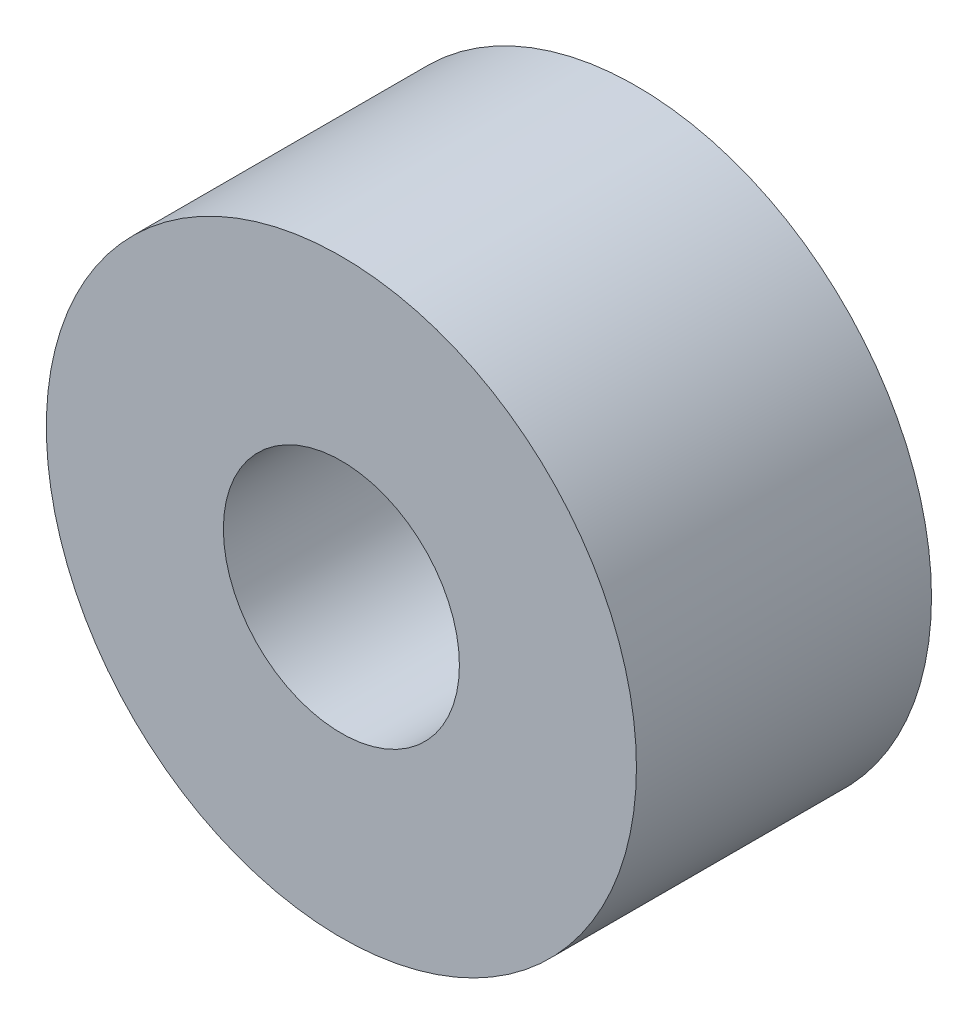
ISO-10303-21;
HEADER;
FILE_DESCRIPTION(('STEP AP214'),'2;1');
FILE_NAME('part.step','',(''),(''),'','','');
FILE_SCHEMA(('AUTOMOTIVE_DESIGN { 1 0 10303 214 1 1 1 1 }'));
ENDSEC;
DATA;
#1=APPLICATION_CONTEXT('core data for automotive mechanical design processes');
#2=APPLICATION_PROTOCOL_DEFINITION('international standard','automotive_design',2000,#1);
#3=PRODUCT_CONTEXT('',#1,'mechanical');
#4=PRODUCT('Part','Part','',(#3));
#5=PRODUCT_RELATED_PRODUCT_CATEGORY('part','',(#4));
#6=PRODUCT_DEFINITION_FORMATION('','',#4);
#7=PRODUCT_DEFINITION_CONTEXT('part definition',#1,'design');
#8=PRODUCT_DEFINITION('design','',#6,#7);
#9=PRODUCT_DEFINITION_SHAPE('','',#8);
#10=(LENGTH_UNIT() NAMED_UNIT(*) SI_UNIT(.MILLI.,.METRE.));
#11=(NAMED_UNIT(*) PLANE_ANGLE_UNIT() SI_UNIT($,.RADIAN.));
#12=(NAMED_UNIT(*) SI_UNIT($,.STERADIAN.) SOLID_ANGLE_UNIT());
#13=UNCERTAINTY_MEASURE_WITH_UNIT(LENGTH_MEASURE(1.E-05),#10,'distance_accuracy_value','');
#14=(GEOMETRIC_REPRESENTATION_CONTEXT(3) GLOBAL_UNCERTAINTY_ASSIGNED_CONTEXT((#13)) GLOBAL_UNIT_ASSIGNED_CONTEXT((#10,
#11,#12)) REPRESENTATION_CONTEXT('',''));
#15=CARTESIAN_POINT('',(0.,0.,0.));
#16=DIRECTION('',(0.,0.,1.));
#17=DIRECTION('',(1.,0.,0.));
#18=AXIS2_PLACEMENT_3D('',#15,#16,#17);
#19=CARTESIAN_POINT('',(0.,0.,1.25));
#20=DIRECTION('',(0.,0.,1.));
#21=DIRECTION('',(1.,0.,0.));
#22=AXIS2_PLACEMENT_3D('',#19,#20,#21);
#23=PLANE('',#22);
#24=CARTESIAN_POINT('',(0.,0.,1.25));
#25=DIRECTION('',(0.,0.,1.));
#26=DIRECTION('',(1.,0.,0.));
#27=AXIS2_PLACEMENT_3D('',#24,#25,#26);
#28=CIRCLE('',#27,2.5);
#29=CARTESIAN_POINT('',(2.5,0.,1.25));
#30=VERTEX_POINT('',#29);
#31=EDGE_CURVE('E10',#30,#30,#28,.T.);
#32=ORIENTED_EDGE('',*,*,#31,.T.);
#33=EDGE_LOOP('',(#32));
#34=FACE_BOUND('',#33,.T.);
#35=CARTESIAN_POINT('',(0.,0.,1.25));
#36=DIRECTION('',(0.,0.,1.));
#37=DIRECTION('',(1.,0.,0.));
#38=AXIS2_PLACEMENT_3D('',#35,#36,#37);
#39=CIRCLE('',#38,1.);
#40=CARTESIAN_POINT('',(1.,0.,1.25));
#41=VERTEX_POINT('',#40);
#42=EDGE_CURVE('E42',#41,#41,#39,.T.);
#43=ORIENTED_EDGE('',*,*,#42,.F.);
#44=EDGE_LOOP('',(#43));
#45=FACE_BOUND('',#44,.T.);
#46=ADVANCED_FACE('F31',(#34,#45),#23,.T.);
#47=CARTESIAN_POINT('',(0.,0.,-1.25));
#48=DIRECTION('',(0.,0.,1.));
#49=DIRECTION('',(1.,0.,0.));
#50=AXIS2_PLACEMENT_3D('',#47,#48,#49);
#51=PLANE('',#50);
#52=CARTESIAN_POINT('',(0.,0.,-1.25));
#53=DIRECTION('',(0.,0.,1.));
#54=DIRECTION('',(1.,0.,0.));
#55=AXIS2_PLACEMENT_3D('',#52,#53,#54);
#56=CIRCLE('',#55,2.5);
#57=CARTESIAN_POINT('',(2.5,0.,-1.25));
#58=VERTEX_POINT('',#57);
#59=EDGE_CURVE('E35',#58,#58,#56,.T.);
#60=ORIENTED_EDGE('',*,*,#59,.F.);
#61=EDGE_LOOP('',(#60));
#62=FACE_BOUND('',#61,.T.);
#63=CARTESIAN_POINT('',(0.,0.,-1.25));
#64=DIRECTION('',(0.,0.,1.));
#65=DIRECTION('',(1.,0.,0.));
#66=AXIS2_PLACEMENT_3D('',#63,#64,#65);
#67=CIRCLE('',#66,1.);
#68=CARTESIAN_POINT('',(1.,0.,-1.25));
#69=VERTEX_POINT('',#68);
#70=EDGE_CURVE('E44',#69,#69,#67,.T.);
#71=ORIENTED_EDGE('',*,*,#70,.T.);
#72=EDGE_LOOP('',(#71));
#73=FACE_BOUND('',#72,.T.);
#74=ADVANCED_FACE('F54',(#62,#73),#51,.F.);
#75=CARTESIAN_POINT('',(0.,0.,1.25));
#76=DIRECTION('',(0.,0.,-1.));
#77=DIRECTION('',(-1.,0.,0.));
#78=AXIS2_PLACEMENT_3D('',#75,#76,#77);
#79=CYLINDRICAL_SURFACE('',#78,2.5);
#80=ORIENTED_EDGE('',*,*,#31,.F.);
#81=EDGE_LOOP('',(#80));
#82=FACE_BOUND('',#81,.T.);
#83=ORIENTED_EDGE('',*,*,#59,.T.);
#84=EDGE_LOOP('',(#83));
#85=FACE_BOUND('',#84,.T.);
#86=ADVANCED_FACE('F33',(#82,#85),#79,.T.);
#87=CARTESIAN_POINT('',(0.,0.,1.25));
#88=DIRECTION('',(0.,0.,-1.));
#89=DIRECTION('',(-1.,0.,0.));
#90=AXIS2_PLACEMENT_3D('',#87,#88,#89);
#91=CYLINDRICAL_SURFACE('',#90,1.);
#92=ORIENTED_EDGE('',*,*,#42,.T.);
#93=EDGE_LOOP('',(#92));
#94=FACE_BOUND('',#93,.T.);
#95=ORIENTED_EDGE('',*,*,#70,.F.);
#96=EDGE_LOOP('',(#95));
#97=FACE_BOUND('',#96,.T.);
#98=ADVANCED_FACE('F50',(#94,#97),#91,.F.);
#99=CLOSED_SHELL('',(#46,#74,#86,#98));
#100=MANIFOLD_SOLID_BREP('B2',#99);
#101=ADVANCED_BREP_SHAPE_REPRESENTATION('',(#18,#100),#14);
#102=SHAPE_DEFINITION_REPRESENTATION(#9,#101);
ENDSEC;
END-ISO-10303-21;
